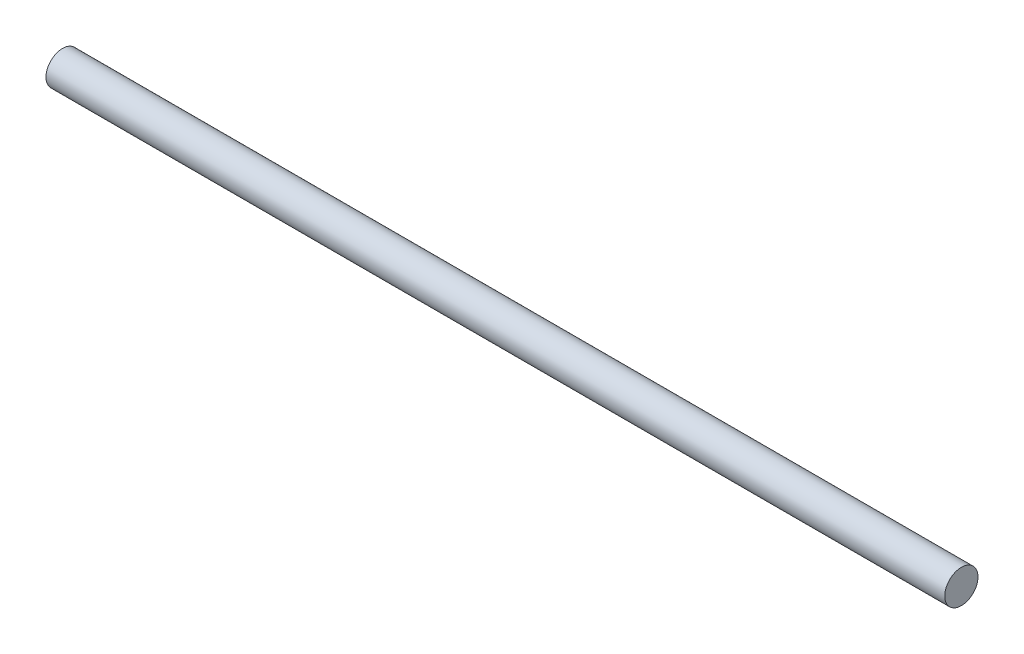
ISO-10303-21;
HEADER;
FILE_DESCRIPTION(('STEP AP214'),'2;1');
FILE_NAME('part.step','',(''),(''),'','','');
FILE_SCHEMA(('AUTOMOTIVE_DESIGN { 1 0 10303 214 1 1 1 1 }'));
ENDSEC;
DATA;
#1=APPLICATION_CONTEXT('core data for automotive mechanical design processes');
#2=APPLICATION_PROTOCOL_DEFINITION('international standard','automotive_design',2000,#1);
#3=PRODUCT_CONTEXT('',#1,'mechanical');
#4=PRODUCT('Part','Part','',(#3));
#5=PRODUCT_RELATED_PRODUCT_CATEGORY('part','',(#4));
#6=PRODUCT_DEFINITION_FORMATION('','',#4);
#7=PRODUCT_DEFINITION_CONTEXT('part definition',#1,'design');
#8=PRODUCT_DEFINITION('design','',#6,#7);
#9=PRODUCT_DEFINITION_SHAPE('','',#8);
#10=(LENGTH_UNIT() NAMED_UNIT(*) SI_UNIT(.MILLI.,.METRE.));
#11=(NAMED_UNIT(*) PLANE_ANGLE_UNIT() SI_UNIT($,.RADIAN.));
#12=(NAMED_UNIT(*) SI_UNIT($,.STERADIAN.) SOLID_ANGLE_UNIT());
#13=UNCERTAINTY_MEASURE_WITH_UNIT(LENGTH_MEASURE(1.E-05),#10,'distance_accuracy_value','');
#14=(GEOMETRIC_REPRESENTATION_CONTEXT(3) GLOBAL_UNCERTAINTY_ASSIGNED_CONTEXT((#13)) GLOBAL_UNIT_ASSIGNED_CONTEXT((#10,
#11,#12)) REPRESENTATION_CONTEXT('',''));
#15=CARTESIAN_POINT('',(0.,0.,0.));
#16=DIRECTION('',(0.,0.,1.));
#17=DIRECTION('',(1.,0.,0.));
#18=AXIS2_PLACEMENT_3D('',#15,#16,#17);
#19=CARTESIAN_POINT('',(300.,0.,0.));
#20=DIRECTION('',(-1.,0.,0.));
#21=DIRECTION('',(0.,0.,1.));
#22=AXIS2_PLACEMENT_3D('',#19,#20,#21);
#23=CYLINDRICAL_SURFACE('',#22,11.1);
#24=CARTESIAN_POINT('',(300.,0.,0.));
#25=DIRECTION('',(1.,0.,0.));
#26=DIRECTION('',(0.,0.,-1.));
#27=AXIS2_PLACEMENT_3D('',#24,#25,#26);
#28=CIRCLE('',#27,11.1);
#29=CARTESIAN_POINT('',(300.,0.,-11.1));
#30=VERTEX_POINT('',#29);
#31=EDGE_CURVE('E10',#30,#30,#28,.T.);
#32=ORIENTED_EDGE('',*,*,#31,.F.);
#33=EDGE_LOOP('',(#32));
#34=FACE_BOUND('',#33,.T.);
#35=CARTESIAN_POINT('',(-300.,0.,0.));
#36=DIRECTION('',(1.,0.,0.));
#37=DIRECTION('',(0.,0.,-1.));
#38=AXIS2_PLACEMENT_3D('',#35,#36,#37);
#39=CIRCLE('',#38,11.1);
#40=CARTESIAN_POINT('',(-300.,0.,-11.1));
#41=VERTEX_POINT('',#40);
#42=EDGE_CURVE('E40',#41,#41,#39,.T.);
#43=ORIENTED_EDGE('',*,*,#42,.T.);
#44=EDGE_LOOP('',(#43));
#45=FACE_BOUND('',#44,.T.);
#46=ADVANCED_FACE('F37',(#34,#45),#23,.T.);
#47=CARTESIAN_POINT('',(300.,0.,0.));
#48=DIRECTION('',(1.,0.,0.));
#49=DIRECTION('',(0.,0.,-1.));
#50=AXIS2_PLACEMENT_3D('',#47,#48,#49);
#51=PLANE('',#50);
#52=ORIENTED_EDGE('',*,*,#31,.T.);
#53=EDGE_LOOP('',(#52));
#54=FACE_BOUND('',#53,.T.);
#55=ADVANCED_FACE('F52',(#54),#51,.T.);
#56=CARTESIAN_POINT('',(-300.,0.,0.));
#57=DIRECTION('',(1.,0.,0.));
#58=DIRECTION('',(0.,0.,-1.));
#59=AXIS2_PLACEMENT_3D('',#56,#57,#58);
#60=PLANE('',#59);
#61=ORIENTED_EDGE('',*,*,#42,.F.);
#62=EDGE_LOOP('',(#61));
#63=FACE_BOUND('',#62,.T.);
#64=ADVANCED_FACE('F50',(#63),#60,.F.);
#65=CLOSED_SHELL('',(#46,#55,#64));
#66=MANIFOLD_SOLID_BREP('B2',#65);
#67=ADVANCED_BREP_SHAPE_REPRESENTATION('',(#18,#66),#14);
#68=SHAPE_DEFINITION_REPRESENTATION(#9,#67);
ENDSEC;
END-ISO-10303-21;
